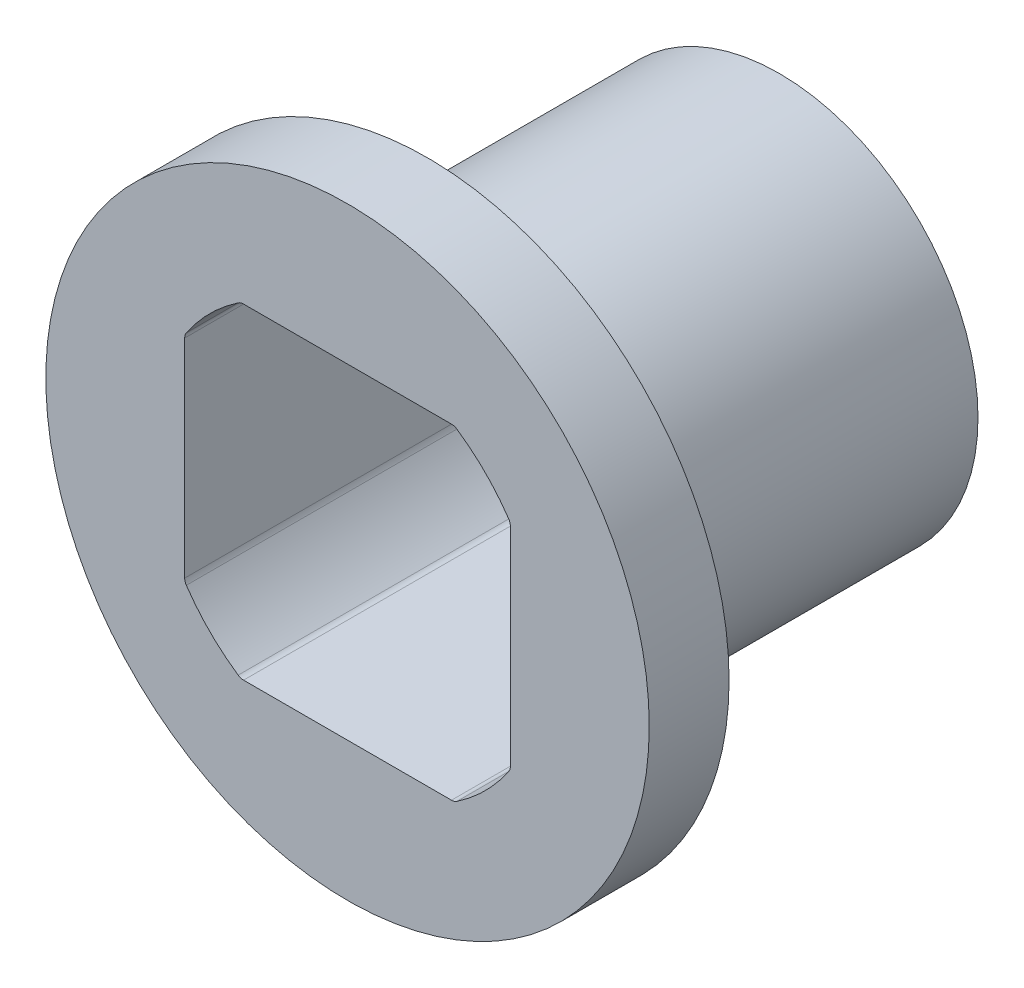
ISO-10303-21;
HEADER;
FILE_DESCRIPTION(('STEP AP214'),'2;1');
FILE_NAME('part.step','',(''),(''),'','','');
FILE_SCHEMA(('AUTOMOTIVE_DESIGN { 1 0 10303 214 1 1 1 1 }'));
ENDSEC;
DATA;
#1=APPLICATION_CONTEXT('core data for automotive mechanical design processes');
#2=APPLICATION_PROTOCOL_DEFINITION('international standard','automotive_design',2000,#1);
#3=PRODUCT_CONTEXT('',#1,'mechanical');
#4=PRODUCT('Part','Part','',(#3));
#5=PRODUCT_RELATED_PRODUCT_CATEGORY('part','',(#4));
#6=PRODUCT_DEFINITION_FORMATION('','',#4);
#7=PRODUCT_DEFINITION_CONTEXT('part definition',#1,'design');
#8=PRODUCT_DEFINITION('design','',#6,#7);
#9=PRODUCT_DEFINITION_SHAPE('','',#8);
#10=(LENGTH_UNIT() NAMED_UNIT(*) SI_UNIT(.MILLI.,.METRE.));
#11=(NAMED_UNIT(*) PLANE_ANGLE_UNIT() SI_UNIT($,.RADIAN.));
#12=(NAMED_UNIT(*) SI_UNIT($,.STERADIAN.) SOLID_ANGLE_UNIT());
#13=UNCERTAINTY_MEASURE_WITH_UNIT(LENGTH_MEASURE(1.E-05),#10,'distance_accuracy_value','');
#14=(GEOMETRIC_REPRESENTATION_CONTEXT(3) GLOBAL_UNCERTAINTY_ASSIGNED_CONTEXT((#13)) GLOBAL_UNIT_ASSIGNED_CONTEXT((#10,
#11,#12)) REPRESENTATION_CONTEXT('',''));
#15=CARTESIAN_POINT('',(0.,0.,0.));
#16=DIRECTION('',(0.,0.,1.));
#17=DIRECTION('',(1.,0.,0.));
#18=AXIS2_PLACEMENT_3D('',#15,#16,#17);
#19=CARTESIAN_POINT('',(0.,0.,8.5875));
#20=DIRECTION('',(0.,0.,-1.));
#21=DIRECTION('',(-1.,0.,0.));
#22=AXIS2_PLACEMENT_3D('',#19,#20,#21);
#23=CYLINDRICAL_SURFACE('',#22,3.9500048);
#24=CARTESIAN_POINT('',(0.,0.,0.));
#25=DIRECTION('',(0.,0.,1.));
#26=DIRECTION('',(1.,0.,0.));
#27=AXIS2_PLACEMENT_3D('',#24,#25,#26);
#28=CIRCLE('',#27,3.9500048);
#29=CARTESIAN_POINT('',(3.9500048,0.,0.));
#30=VERTEX_POINT('',#29);
#31=EDGE_CURVE('E49',#30,#30,#28,.T.);
#32=ORIENTED_EDGE('',*,*,#31,.T.);
#33=EDGE_LOOP('',(#32));
#34=FACE_BOUND('',#33,.T.);
#35=CARTESIAN_POINT('',(0.,0.,7.));
#36=DIRECTION('',(0.,0.,1.));
#37=DIRECTION('',(1.,0.,0.));
#38=AXIS2_PLACEMENT_3D('',#35,#36,#37);
#39=CIRCLE('',#38,3.9500048);
#40=CARTESIAN_POINT('',(3.9500048,0.,7.));
#41=VERTEX_POINT('',#40);
#42=EDGE_CURVE('E11',#41,#41,#39,.T.);
#43=ORIENTED_EDGE('',*,*,#42,.F.);
#44=EDGE_LOOP('',(#43));
#45=FACE_BOUND('',#44,.T.);
#46=ADVANCED_FACE('F41',(#34,#45),#23,.T.);
#47=CARTESIAN_POINT('',(0.,0.,8.5875));
#48=DIRECTION('',(0.,0.,1.));
#49=DIRECTION('',(1.,0.,0.));
#50=AXIS2_PLACEMENT_3D('',#47,#48,#49);
#51=PLANE('',#50);
#52=DIRECTION('',(1.,0.,0.));
#53=VECTOR('',#52,1.);
#54=CARTESIAN_POINT('',(-2.06741021570466,-3.2385,8.5875));
#55=LINE('',#54,#53);
#56=CARTESIAN_POINT('',(-2.06741021570466,-3.2385,8.5875));
#57=VERTEX_POINT('',#56);
#58=CARTESIAN_POINT('',(2.06741021570466,-3.2385,8.5875));
#59=VERTEX_POINT('',#58);
#60=EDGE_CURVE('E163',#57,#59,#55,.T.);
#61=ORIENTED_EDGE('',*,*,#60,.F.);
#62=CARTESIAN_POINT('',(-2.06741021570466,-3.048,8.5875));
#63=DIRECTION('',(0.,0.,1.));
#64=DIRECTION('',(1.,0.,0.));
#65=AXIS2_PLACEMENT_3D('',#62,#63,#64);
#66=CIRCLE('',#65,0.190500000000001);
#67=CARTESIAN_POINT('',(-2.17434522686168,-3.20565517241387,8.5875));
#68=VERTEX_POINT('',#67);
#69=EDGE_CURVE('E154',#68,#57,#66,.T.);
#70=ORIENTED_EDGE('',*,*,#69,.F.);
#71=CARTESIAN_POINT('',(0.,0.,8.5875));
#72=DIRECTION('',(0.,0.,1.));
#73=DIRECTION('',(1.,0.,0.));
#74=AXIS2_PLACEMENT_3D('',#71,#72,#73);
#75=CIRCLE('',#74,3.8735);
#76=CARTESIAN_POINT('',(-3.20565517241379,-2.1743452268618,8.5875));
#77=VERTEX_POINT('',#76);
#78=EDGE_CURVE('E221',#77,#68,#75,.T.);
#79=ORIENTED_EDGE('',*,*,#78,.F.);
#80=CARTESIAN_POINT('',(-3.048,-2.06741021570466,8.5875));
#81=DIRECTION('',(0.,0.,1.));
#82=DIRECTION('',(1.,0.,0.));
#83=AXIS2_PLACEMENT_3D('',#80,#81,#82);
#84=CIRCLE('',#83,0.190500000000001);
#85=CARTESIAN_POINT('',(-3.2385,-2.06741021570466,8.5875));
#86=VERTEX_POINT('',#85);
#87=EDGE_CURVE('E218',#86,#77,#84,.T.);
#88=ORIENTED_EDGE('',*,*,#87,.F.);
#89=DIRECTION('',(0.,-1.,0.));
#90=VECTOR('',#89,1.);
#91=CARTESIAN_POINT('',(-3.2385,2.06741021570466,8.5875));
#92=LINE('',#91,#90);
#93=CARTESIAN_POINT('',(-3.2385,2.06741021570466,8.5875));
#94=VERTEX_POINT('',#93);
#95=EDGE_CURVE('E215',#94,#86,#92,.T.);
#96=ORIENTED_EDGE('',*,*,#95,.F.);
#97=CARTESIAN_POINT('',(-3.048,2.06741021570466,8.5875));
#98=DIRECTION('',(0.,0.,1.));
#99=DIRECTION('',(1.,0.,0.));
#100=AXIS2_PLACEMENT_3D('',#97,#98,#99);
#101=CIRCLE('',#100,0.190500000000003);
#102=CARTESIAN_POINT('',(-3.20565517241388,2.17434522686168,8.5875));
#103=VERTEX_POINT('',#102);
#104=EDGE_CURVE('E212',#103,#94,#101,.T.);
#105=ORIENTED_EDGE('',*,*,#104,.F.);
#106=CARTESIAN_POINT('',(0.,0.,8.5875));
#107=DIRECTION('',(0.,0.,1.));
#108=DIRECTION('',(1.,0.,0.));
#109=AXIS2_PLACEMENT_3D('',#106,#107,#108);
#110=CIRCLE('',#109,3.8735);
#111=CARTESIAN_POINT('',(-2.1743452268618,3.20565517241379,8.5875));
#112=VERTEX_POINT('',#111);
#113=EDGE_CURVE('E209',#112,#103,#110,.T.);
#114=ORIENTED_EDGE('',*,*,#113,.F.);
#115=CARTESIAN_POINT('',(-2.06741021570466,3.048,8.5875));
#116=DIRECTION('',(0.,0.,1.));
#117=DIRECTION('',(1.,0.,0.));
#118=AXIS2_PLACEMENT_3D('',#115,#116,#117);
#119=CIRCLE('',#118,0.190500000000001);
#120=CARTESIAN_POINT('',(-2.06741021570466,3.2385,8.5875));
#121=VERTEX_POINT('',#120);
#122=EDGE_CURVE('E206',#121,#112,#119,.T.);
#123=ORIENTED_EDGE('',*,*,#122,.F.);
#124=DIRECTION('',(-1.,0.,0.));
#125=VECTOR('',#124,1.);
#126=CARTESIAN_POINT('',(2.06741021570466,3.2385,8.5875));
#127=LINE('',#126,#125);
#128=CARTESIAN_POINT('',(2.06741021570466,3.2385,8.5875));
#129=VERTEX_POINT('',#128);
#130=EDGE_CURVE('E203',#129,#121,#127,.T.);
#131=ORIENTED_EDGE('',*,*,#130,.F.);
#132=CARTESIAN_POINT('',(2.06741021570466,3.048,8.5875));
#133=DIRECTION('',(0.,0.,1.));
#134=DIRECTION('',(1.,0.,0.));
#135=AXIS2_PLACEMENT_3D('',#132,#133,#134);
#136=CIRCLE('',#135,0.190500000000001);
#137=CARTESIAN_POINT('',(2.1743452268618,3.20565517241379,8.5875));
#138=VERTEX_POINT('',#137);
#139=EDGE_CURVE('E200',#138,#129,#136,.T.);
#140=ORIENTED_EDGE('',*,*,#139,.F.);
#141=CARTESIAN_POINT('',(0.,0.,8.5875));
#142=DIRECTION('',(0.,0.,1.));
#143=DIRECTION('',(1.,0.,0.));
#144=AXIS2_PLACEMENT_3D('',#141,#142,#143);
#145=CIRCLE('',#144,3.8735);
#146=CARTESIAN_POINT('',(3.20565517241379,2.1743452268618,8.5875));
#147=VERTEX_POINT('',#146);
#148=EDGE_CURVE('E197',#147,#138,#145,.T.);
#149=ORIENTED_EDGE('',*,*,#148,.F.);
#150=CARTESIAN_POINT('',(3.048,2.06741021570466,8.5875));
#151=DIRECTION('',(0.,0.,1.));
#152=DIRECTION('',(1.,0.,0.));
#153=AXIS2_PLACEMENT_3D('',#150,#151,#152);
#154=CIRCLE('',#153,0.190500000000001);
#155=CARTESIAN_POINT('',(3.2385,2.06741021570466,8.5875));
#156=VERTEX_POINT('',#155);
#157=EDGE_CURVE('E194',#156,#147,#154,.T.);
#158=ORIENTED_EDGE('',*,*,#157,.F.);
#159=DIRECTION('',(0.,1.,0.));
#160=VECTOR('',#159,1.);
#161=CARTESIAN_POINT('',(3.2385,-2.06741021570466,8.5875));
#162=LINE('',#161,#160);
#163=CARTESIAN_POINT('',(3.2385,-2.06741021570466,8.5875));
#164=VERTEX_POINT('',#163);
#165=EDGE_CURVE('E191',#164,#156,#162,.T.);
#166=ORIENTED_EDGE('',*,*,#165,.F.);
#167=CARTESIAN_POINT('',(3.048,-2.06741021570466,8.5875));
#168=DIRECTION('',(0.,0.,1.));
#169=DIRECTION('',(1.,0.,0.));
#170=AXIS2_PLACEMENT_3D('',#167,#168,#169);
#171=CIRCLE('',#170,0.190500000000001);
#172=CARTESIAN_POINT('',(3.20565517241379,-2.1743452268618,8.5875));
#173=VERTEX_POINT('',#172);
#174=EDGE_CURVE('E188',#173,#164,#171,.T.);
#175=ORIENTED_EDGE('',*,*,#174,.F.);
#176=CARTESIAN_POINT('',(0.,0.,8.5875));
#177=DIRECTION('',(0.,0.,1.));
#178=DIRECTION('',(1.,0.,0.));
#179=AXIS2_PLACEMENT_3D('',#176,#177,#178);
#180=CIRCLE('',#179,3.8735);
#181=CARTESIAN_POINT('',(2.1743452268618,-3.20565517241379,8.5875));
#182=VERTEX_POINT('',#181);
#183=EDGE_CURVE('E182',#182,#173,#180,.T.);
#184=ORIENTED_EDGE('',*,*,#183,.F.);
#185=CARTESIAN_POINT('',(2.06741021570466,-3.048,8.5875));
#186=DIRECTION('',(0.,0.,1.));
#187=DIRECTION('',(1.,0.,0.));
#188=AXIS2_PLACEMENT_3D('',#185,#186,#187);
#189=CIRCLE('',#188,0.190500000000001);
#190=EDGE_CURVE('E178',#59,#182,#189,.T.);
#191=ORIENTED_EDGE('',*,*,#190,.F.);
#192=EDGE_LOOP('',(#61,#70,#79,#88,#96,#105,#114,#123,#131,#140,#149,#158,#166,#175,#184,#191));
#193=FACE_BOUND('',#192,.T.);
#194=CARTESIAN_POINT('',(0.,0.,8.5875));
#195=DIRECTION('',(0.,0.,1.));
#196=DIRECTION('',(1.,0.,0.));
#197=AXIS2_PLACEMENT_3D('',#194,#195,#196);
#198=CIRCLE('',#197,6.);
#199=CARTESIAN_POINT('',(6.,0.,8.5875));
#200=VERTEX_POINT('',#199);
#201=EDGE_CURVE('E601',#200,#200,#198,.T.);
#202=ORIENTED_EDGE('',*,*,#201,.T.);
#203=EDGE_LOOP('',(#202));
#204=FACE_BOUND('',#203,.T.);
#205=ADVANCED_FACE('F175',(#193,#204),#51,.T.);
#206=CARTESIAN_POINT('',(0.,0.,0.));
#207=DIRECTION('',(0.,0.,1.));
#208=DIRECTION('',(1.,0.,0.));
#209=AXIS2_PLACEMENT_3D('',#206,#207,#208);
#210=PLANE('',#209);
#211=ORIENTED_EDGE('',*,*,#31,.F.);
#212=EDGE_LOOP('',(#211));
#213=FACE_BOUND('',#212,.T.);
#214=CARTESIAN_POINT('',(-2.06741021570466,-3.048,0.));
#215=DIRECTION('',(0.,0.,1.));
#216=DIRECTION('',(1.,0.,0.));
#217=AXIS2_PLACEMENT_3D('',#214,#215,#216);
#218=CIRCLE('',#217,0.190500000000001);
#219=CARTESIAN_POINT('',(-2.17434522686168,-3.20565517241387,0.));
#220=VERTEX_POINT('',#219);
#221=CARTESIAN_POINT('',(-2.06741021570466,-3.2385,0.));
#222=VERTEX_POINT('',#221);
#223=EDGE_CURVE('E64',#220,#222,#218,.T.);
#224=ORIENTED_EDGE('',*,*,#223,.T.);
#225=DIRECTION('',(1.,0.,0.));
#226=VECTOR('',#225,1.);
#227=CARTESIAN_POINT('',(-2.06741021570466,-3.2385,0.));
#228=LINE('',#227,#226);
#229=CARTESIAN_POINT('',(2.06741021570466,-3.2385,0.));
#230=VERTEX_POINT('',#229);
#231=EDGE_CURVE('E170',#222,#230,#228,.T.);
#232=ORIENTED_EDGE('',*,*,#231,.T.);
#233=CARTESIAN_POINT('',(2.06741021570466,-3.048,0.));
#234=DIRECTION('',(0.,0.,1.));
#235=DIRECTION('',(1.,0.,0.));
#236=AXIS2_PLACEMENT_3D('',#233,#234,#235);
#237=CIRCLE('',#236,0.190500000000001);
#238=CARTESIAN_POINT('',(2.1743452268618,-3.20565517241379,0.));
#239=VERTEX_POINT('',#238);
#240=EDGE_CURVE('E229',#230,#239,#237,.T.);
#241=ORIENTED_EDGE('',*,*,#240,.T.);
#242=CARTESIAN_POINT('',(0.,0.,0.));
#243=DIRECTION('',(0.,0.,1.));
#244=DIRECTION('',(1.,0.,0.));
#245=AXIS2_PLACEMENT_3D('',#242,#243,#244);
#246=CIRCLE('',#245,3.8735);
#247=CARTESIAN_POINT('',(3.20565517241379,-2.1743452268618,0.));
#248=VERTEX_POINT('',#247);
#249=EDGE_CURVE('E233',#239,#248,#246,.T.);
#250=ORIENTED_EDGE('',*,*,#249,.T.);
#251=CARTESIAN_POINT('',(3.048,-2.06741021570466,0.));
#252=DIRECTION('',(0.,0.,1.));
#253=DIRECTION('',(1.,0.,0.));
#254=AXIS2_PLACEMENT_3D('',#251,#252,#253);
#255=CIRCLE('',#254,0.190500000000001);
#256=CARTESIAN_POINT('',(3.2385,-2.06741021570466,0.));
#257=VERTEX_POINT('',#256);
#258=EDGE_CURVE('E237',#248,#257,#255,.T.);
#259=ORIENTED_EDGE('',*,*,#258,.T.);
#260=DIRECTION('',(0.,1.,0.));
#261=VECTOR('',#260,1.);
#262=CARTESIAN_POINT('',(3.2385,0.,0.));
#263=LINE('',#262,#261);
#264=CARTESIAN_POINT('',(3.2385,2.06741021570466,0.));
#265=VERTEX_POINT('',#264);
#266=EDGE_CURVE('E241',#257,#265,#263,.T.);
#267=ORIENTED_EDGE('',*,*,#266,.T.);
#268=CARTESIAN_POINT('',(3.048,2.06741021570466,0.));
#269=DIRECTION('',(0.,0.,1.));
#270=DIRECTION('',(1.,0.,0.));
#271=AXIS2_PLACEMENT_3D('',#268,#269,#270);
#272=CIRCLE('',#271,0.190500000000001);
#273=CARTESIAN_POINT('',(3.20565517241379,2.1743452268618,0.));
#274=VERTEX_POINT('',#273);
#275=EDGE_CURVE('E245',#265,#274,#272,.T.);
#276=ORIENTED_EDGE('',*,*,#275,.T.);
#277=CARTESIAN_POINT('',(0.,0.,0.));
#278=DIRECTION('',(0.,0.,1.));
#279=DIRECTION('',(1.,0.,0.));
#280=AXIS2_PLACEMENT_3D('',#277,#278,#279);
#281=CIRCLE('',#280,3.8735);
#282=CARTESIAN_POINT('',(2.1743452268618,3.20565517241379,0.));
#283=VERTEX_POINT('',#282);
#284=EDGE_CURVE('E249',#274,#283,#281,.T.);
#285=ORIENTED_EDGE('',*,*,#284,.T.);
#286=CARTESIAN_POINT('',(2.06741021570466,3.048,0.));
#287=DIRECTION('',(0.,0.,1.));
#288=DIRECTION('',(1.,0.,0.));
#289=AXIS2_PLACEMENT_3D('',#286,#287,#288);
#290=CIRCLE('',#289,0.190500000000001);
#291=CARTESIAN_POINT('',(2.06741021570466,3.2385,0.));
#292=VERTEX_POINT('',#291);
#293=EDGE_CURVE('E253',#283,#292,#290,.T.);
#294=ORIENTED_EDGE('',*,*,#293,.T.);
#295=DIRECTION('',(-1.,0.,0.));
#296=VECTOR('',#295,1.);
#297=CARTESIAN_POINT('',(2.06741021570466,3.2385,0.));
#298=LINE('',#297,#296);
#299=CARTESIAN_POINT('',(-2.06741021570466,3.2385,0.));
#300=VERTEX_POINT('',#299);
#301=EDGE_CURVE('E257',#292,#300,#298,.T.);
#302=ORIENTED_EDGE('',*,*,#301,.T.);
#303=CARTESIAN_POINT('',(-2.06741021570466,3.048,0.));
#304=DIRECTION('',(0.,0.,1.));
#305=DIRECTION('',(1.,0.,0.));
#306=AXIS2_PLACEMENT_3D('',#303,#304,#305);
#307=CIRCLE('',#306,0.190500000000001);
#308=CARTESIAN_POINT('',(-2.1743452268618,3.20565517241379,0.));
#309=VERTEX_POINT('',#308);
#310=EDGE_CURVE('E261',#300,#309,#307,.T.);
#311=ORIENTED_EDGE('',*,*,#310,.T.);
#312=CARTESIAN_POINT('',(0.,0.,0.));
#313=DIRECTION('',(0.,0.,1.));
#314=DIRECTION('',(1.,0.,0.));
#315=AXIS2_PLACEMENT_3D('',#312,#313,#314);
#316=CIRCLE('',#315,3.8735);
#317=CARTESIAN_POINT('',(-3.20565517241388,2.17434522686168,0.));
#318=VERTEX_POINT('',#317);
#319=EDGE_CURVE('E265',#309,#318,#316,.T.);
#320=ORIENTED_EDGE('',*,*,#319,.T.);
#321=CARTESIAN_POINT('',(-3.048,2.06741021570466,0.));
#322=DIRECTION('',(0.,0.,1.));
#323=DIRECTION('',(1.,0.,0.));
#324=AXIS2_PLACEMENT_3D('',#321,#322,#323);
#325=CIRCLE('',#324,0.190500000000003);
#326=CARTESIAN_POINT('',(-3.2385,2.06741021570466,0.));
#327=VERTEX_POINT('',#326);
#328=EDGE_CURVE('E269',#318,#327,#325,.T.);
#329=ORIENTED_EDGE('',*,*,#328,.T.);
#330=DIRECTION('',(0.,-1.,0.));
#331=VECTOR('',#330,1.);
#332=CARTESIAN_POINT('',(-3.2385,0.,0.));
#333=LINE('',#332,#331);
#334=CARTESIAN_POINT('',(-3.2385,-2.06741021570466,0.));
#335=VERTEX_POINT('',#334);
#336=EDGE_CURVE('E273',#327,#335,#333,.T.);
#337=ORIENTED_EDGE('',*,*,#336,.T.);
#338=CARTESIAN_POINT('',(-3.048,-2.06741021570466,0.));
#339=DIRECTION('',(0.,0.,1.));
#340=DIRECTION('',(1.,0.,0.));
#341=AXIS2_PLACEMENT_3D('',#338,#339,#340);
#342=CIRCLE('',#341,0.190500000000001);
#343=CARTESIAN_POINT('',(-3.20565517241379,-2.1743452268618,0.));
#344=VERTEX_POINT('',#343);
#345=EDGE_CURVE('E277',#335,#344,#342,.T.);
#346=ORIENTED_EDGE('',*,*,#345,.T.);
#347=CARTESIAN_POINT('',(0.,0.,0.));
#348=DIRECTION('',(0.,0.,1.));
#349=DIRECTION('',(1.,0.,0.));
#350=AXIS2_PLACEMENT_3D('',#347,#348,#349);
#351=CIRCLE('',#350,3.8735);
#352=EDGE_CURVE('E164',#344,#220,#351,.T.);
#353=ORIENTED_EDGE('',*,*,#352,.T.);
#354=EDGE_LOOP('',(#224,#232,#241,#250,#259,#267,#276,#285,#294,#302,#311,#320,#329,#337,#346,#353));
#355=FACE_BOUND('',#354,.T.);
#356=ADVANCED_FACE('F333',(#213,#355),#210,.F.);
#357=CARTESIAN_POINT('',(-2.06741021570466,-3.048,8.5875));
#358=DIRECTION('',(0.,0.,-1.));
#359=DIRECTION('',(-1.,0.,0.));
#360=AXIS2_PLACEMENT_3D('',#357,#358,#359);
#361=CYLINDRICAL_SURFACE('',#360,0.190500000000001);
#362=ORIENTED_EDGE('',*,*,#223,.F.);
#363=DIRECTION('',(0.,0.,-1.));
#364=VECTOR('',#363,1.);
#365=CARTESIAN_POINT('',(-2.17434522686168,-3.20565517241387,8.5875));
#366=LINE('',#365,#364);
#367=EDGE_CURVE('E158',#68,#220,#366,.T.);
#368=ORIENTED_EDGE('',*,*,#367,.F.);
#369=ORIENTED_EDGE('',*,*,#69,.T.);
#370=DIRECTION('',(0.,0.,-1.));
#371=VECTOR('',#370,1.);
#372=CARTESIAN_POINT('',(-2.06741021570466,-3.2385,8.5875));
#373=LINE('',#372,#371);
#374=EDGE_CURVE('E157',#57,#222,#373,.T.);
#375=ORIENTED_EDGE('',*,*,#374,.T.);
#376=EDGE_LOOP('',(#362,#368,#369,#375));
#377=FACE_BOUND('',#376,.T.);
#378=ADVANCED_FACE('F156',(#377),#361,.F.);
#379=CARTESIAN_POINT('',(-2.06741021570466,-3.2385,8.5875));
#380=DIRECTION('',(0.,1.,0.));
#381=DIRECTION('',(0.,0.,1.));
#382=AXIS2_PLACEMENT_3D('',#379,#380,#381);
#383=PLANE('',#382);
#384=ORIENTED_EDGE('',*,*,#231,.F.);
#385=ORIENTED_EDGE('',*,*,#374,.F.);
#386=ORIENTED_EDGE('',*,*,#60,.T.);
#387=DIRECTION('',(0.,0.,-1.));
#388=VECTOR('',#387,1.);
#389=CARTESIAN_POINT('',(2.06741021570466,-3.2385,8.5875));
#390=LINE('',#389,#388);
#391=EDGE_CURVE('E172',#59,#230,#390,.T.);
#392=ORIENTED_EDGE('',*,*,#391,.T.);
#393=EDGE_LOOP('',(#384,#385,#386,#392));
#394=FACE_BOUND('',#393,.T.);
#395=ADVANCED_FACE('F167',(#394),#383,.T.);
#396=CARTESIAN_POINT('',(2.06741021570466,-3.048,8.5875));
#397=DIRECTION('',(0.,0.,-1.));
#398=DIRECTION('',(-1.,0.,0.));
#399=AXIS2_PLACEMENT_3D('',#396,#397,#398);
#400=CYLINDRICAL_SURFACE('',#399,0.190500000000001);
#401=ORIENTED_EDGE('',*,*,#240,.F.);
#402=ORIENTED_EDGE('',*,*,#391,.F.);
#403=ORIENTED_EDGE('',*,*,#190,.T.);
#404=DIRECTION('',(0.,0.,-1.));
#405=VECTOR('',#404,1.);
#406=CARTESIAN_POINT('',(2.1743452268618,-3.20565517241379,8.5875));
#407=LINE('',#406,#405);
#408=EDGE_CURVE('E323',#182,#239,#407,.T.);
#409=ORIENTED_EDGE('',*,*,#408,.T.);
#410=EDGE_LOOP('',(#401,#402,#403,#409));
#411=FACE_BOUND('',#410,.T.);
#412=ADVANCED_FACE('F396',(#411),#400,.F.);
#413=CARTESIAN_POINT('',(0.,0.,8.5875));
#414=DIRECTION('',(0.,0.,-1.));
#415=DIRECTION('',(-1.,0.,0.));
#416=AXIS2_PLACEMENT_3D('',#413,#414,#415);
#417=CYLINDRICAL_SURFACE('',#416,3.8735);
#418=ORIENTED_EDGE('',*,*,#249,.F.);
#419=ORIENTED_EDGE('',*,*,#408,.F.);
#420=ORIENTED_EDGE('',*,*,#183,.T.);
#421=DIRECTION('',(0.,0.,-1.));
#422=VECTOR('',#421,1.);
#423=CARTESIAN_POINT('',(3.20565517241379,-2.1743452268618,8.5875));
#424=LINE('',#423,#422);
#425=EDGE_CURVE('E320',#173,#248,#424,.T.);
#426=ORIENTED_EDGE('',*,*,#425,.T.);
#427=EDGE_LOOP('',(#418,#419,#420,#426));
#428=FACE_BOUND('',#427,.T.);
#429=ADVANCED_FACE('F392',(#428),#417,.F.);
#430=CARTESIAN_POINT('',(3.048,-2.06741021570466,8.5875));
#431=DIRECTION('',(0.,0.,-1.));
#432=DIRECTION('',(-1.,0.,0.));
#433=AXIS2_PLACEMENT_3D('',#430,#431,#432);
#434=CYLINDRICAL_SURFACE('',#433,0.190500000000001);
#435=ORIENTED_EDGE('',*,*,#258,.F.);
#436=ORIENTED_EDGE('',*,*,#425,.F.);
#437=ORIENTED_EDGE('',*,*,#174,.T.);
#438=DIRECTION('',(0.,0.,-1.));
#439=VECTOR('',#438,1.);
#440=CARTESIAN_POINT('',(3.2385,-2.06741021570466,8.5875));
#441=LINE('',#440,#439);
#442=EDGE_CURVE('E316',#164,#257,#441,.T.);
#443=ORIENTED_EDGE('',*,*,#442,.T.);
#444=EDGE_LOOP('',(#435,#436,#437,#443));
#445=FACE_BOUND('',#444,.T.);
#446=ADVANCED_FACE('F389',(#445),#434,.F.);
#447=CARTESIAN_POINT('',(3.2385,0.,8.5875));
#448=DIRECTION('',(-1.,0.,0.));
#449=DIRECTION('',(0.,0.,1.));
#450=AXIS2_PLACEMENT_3D('',#447,#448,#449);
#451=PLANE('',#450);
#452=ORIENTED_EDGE('',*,*,#266,.F.);
#453=ORIENTED_EDGE('',*,*,#442,.F.);
#454=ORIENTED_EDGE('',*,*,#165,.T.);
#455=DIRECTION('',(0.,0.,-1.));
#456=VECTOR('',#455,1.);
#457=CARTESIAN_POINT('',(3.2385,2.06741021570466,8.5875));
#458=LINE('',#457,#456);
#459=EDGE_CURVE('E313',#156,#265,#458,.T.);
#460=ORIENTED_EDGE('',*,*,#459,.T.);
#461=EDGE_LOOP('',(#452,#453,#454,#460));
#462=FACE_BOUND('',#461,.T.);
#463=ADVANCED_FACE('F383',(#462),#451,.T.);
#464=CARTESIAN_POINT('',(3.048,2.06741021570466,8.5875));
#465=DIRECTION('',(0.,0.,-1.));
#466=DIRECTION('',(-1.,0.,0.));
#467=AXIS2_PLACEMENT_3D('',#464,#465,#466);
#468=CYLINDRICAL_SURFACE('',#467,0.190500000000001);
#469=ORIENTED_EDGE('',*,*,#275,.F.);
#470=ORIENTED_EDGE('',*,*,#459,.F.);
#471=ORIENTED_EDGE('',*,*,#157,.T.);
#472=DIRECTION('',(0.,0.,-1.));
#473=VECTOR('',#472,1.);
#474=CARTESIAN_POINT('',(3.20565517241379,2.1743452268618,8.5875));
#475=LINE('',#474,#473);
#476=EDGE_CURVE('E310',#147,#274,#475,.T.);
#477=ORIENTED_EDGE('',*,*,#476,.T.);
#478=EDGE_LOOP('',(#469,#470,#471,#477));
#479=FACE_BOUND('',#478,.T.);
#480=ADVANCED_FACE('F380',(#479),#468,.F.);
#481=CARTESIAN_POINT('',(0.,0.,8.5875));
#482=DIRECTION('',(0.,0.,-1.));
#483=DIRECTION('',(-1.,0.,0.));
#484=AXIS2_PLACEMENT_3D('',#481,#482,#483);
#485=CYLINDRICAL_SURFACE('',#484,3.8735);
#486=ORIENTED_EDGE('',*,*,#284,.F.);
#487=ORIENTED_EDGE('',*,*,#476,.F.);
#488=ORIENTED_EDGE('',*,*,#148,.T.);
#489=DIRECTION('',(0.,0.,-1.));
#490=VECTOR('',#489,1.);
#491=CARTESIAN_POINT('',(2.1743452268618,3.20565517241379,8.5875));
#492=LINE('',#491,#490);
#493=EDGE_CURVE('E307',#138,#283,#492,.T.);
#494=ORIENTED_EDGE('',*,*,#493,.T.);
#495=EDGE_LOOP('',(#486,#487,#488,#494));
#496=FACE_BOUND('',#495,.T.);
#497=ADVANCED_FACE('F377',(#496),#485,.F.);
#498=CARTESIAN_POINT('',(2.06741021570466,3.048,8.5875));
#499=DIRECTION('',(0.,0.,-1.));
#500=DIRECTION('',(-1.,0.,0.));
#501=AXIS2_PLACEMENT_3D('',#498,#499,#500);
#502=CYLINDRICAL_SURFACE('',#501,0.190500000000001);
#503=ORIENTED_EDGE('',*,*,#293,.F.);
#504=ORIENTED_EDGE('',*,*,#493,.F.);
#505=ORIENTED_EDGE('',*,*,#139,.T.);
#506=DIRECTION('',(0.,0.,-1.));
#507=VECTOR('',#506,1.);
#508=CARTESIAN_POINT('',(2.06741021570466,3.2385,8.5875));
#509=LINE('',#508,#507);
#510=EDGE_CURVE('E304',#129,#292,#509,.T.);
#511=ORIENTED_EDGE('',*,*,#510,.T.);
#512=EDGE_LOOP('',(#503,#504,#505,#511));
#513=FACE_BOUND('',#512,.T.);
#514=ADVANCED_FACE('F369',(#513),#502,.F.);
#515=CARTESIAN_POINT('',(2.06741021570466,3.2385,8.5875));
#516=DIRECTION('',(0.,-1.,0.));
#517=DIRECTION('',(1.,0.,0.));
#518=AXIS2_PLACEMENT_3D('',#515,#516,#517);
#519=PLANE('',#518);
#520=ORIENTED_EDGE('',*,*,#301,.F.);
#521=ORIENTED_EDGE('',*,*,#510,.F.);
#522=ORIENTED_EDGE('',*,*,#130,.T.);
#523=DIRECTION('',(0.,0.,-1.));
#524=VECTOR('',#523,1.);
#525=CARTESIAN_POINT('',(-2.06741021570466,3.2385,8.5875));
#526=LINE('',#525,#524);
#527=EDGE_CURVE('E301',#121,#300,#526,.T.);
#528=ORIENTED_EDGE('',*,*,#527,.T.);
#529=EDGE_LOOP('',(#520,#521,#522,#528));
#530=FACE_BOUND('',#529,.T.);
#531=ADVANCED_FACE('F365',(#530),#519,.T.);
#532=CARTESIAN_POINT('',(-2.06741021570466,3.048,8.5875));
#533=DIRECTION('',(0.,0.,-1.));
#534=DIRECTION('',(-1.,0.,0.));
#535=AXIS2_PLACEMENT_3D('',#532,#533,#534);
#536=CYLINDRICAL_SURFACE('',#535,0.190500000000001);
#537=ORIENTED_EDGE('',*,*,#310,.F.);
#538=ORIENTED_EDGE('',*,*,#527,.F.);
#539=ORIENTED_EDGE('',*,*,#122,.T.);
#540=DIRECTION('',(0.,0.,-1.));
#541=VECTOR('',#540,1.);
#542=CARTESIAN_POINT('',(-2.1743452268618,3.20565517241379,8.5875));
#543=LINE('',#542,#541);
#544=EDGE_CURVE('E298',#112,#309,#543,.T.);
#545=ORIENTED_EDGE('',*,*,#544,.T.);
#546=EDGE_LOOP('',(#537,#538,#539,#545));
#547=FACE_BOUND('',#546,.T.);
#548=ADVANCED_FACE('F362',(#547),#536,.F.);
#549=CARTESIAN_POINT('',(0.,0.,8.5875));
#550=DIRECTION('',(0.,0.,-1.));
#551=DIRECTION('',(-1.,0.,0.));
#552=AXIS2_PLACEMENT_3D('',#549,#550,#551);
#553=CYLINDRICAL_SURFACE('',#552,3.8735);
#554=ORIENTED_EDGE('',*,*,#319,.F.);
#555=ORIENTED_EDGE('',*,*,#544,.F.);
#556=ORIENTED_EDGE('',*,*,#113,.T.);
#557=DIRECTION('',(0.,0.,-1.));
#558=VECTOR('',#557,1.);
#559=CARTESIAN_POINT('',(-3.20565517241388,2.17434522686168,8.5875));
#560=LINE('',#559,#558);
#561=EDGE_CURVE('E295',#103,#318,#560,.T.);
#562=ORIENTED_EDGE('',*,*,#561,.T.);
#563=EDGE_LOOP('',(#554,#555,#556,#562));
#564=FACE_BOUND('',#563,.T.);
#565=ADVANCED_FACE('F355',(#564),#553,.F.);
#566=CARTESIAN_POINT('',(-3.048,2.06741021570466,8.5875));
#567=DIRECTION('',(0.,0.,-1.));
#568=DIRECTION('',(-1.,0.,0.));
#569=AXIS2_PLACEMENT_3D('',#566,#567,#568);
#570=CYLINDRICAL_SURFACE('',#569,0.190500000000003);
#571=ORIENTED_EDGE('',*,*,#328,.F.);
#572=ORIENTED_EDGE('',*,*,#561,.F.);
#573=ORIENTED_EDGE('',*,*,#104,.T.);
#574=DIRECTION('',(0.,0.,-1.));
#575=VECTOR('',#574,1.);
#576=CARTESIAN_POINT('',(-3.2385,2.06741021570466,8.5875));
#577=LINE('',#576,#575);
#578=EDGE_CURVE('E291',#94,#327,#577,.T.);
#579=ORIENTED_EDGE('',*,*,#578,.T.);
#580=EDGE_LOOP('',(#571,#572,#573,#579));
#581=FACE_BOUND('',#580,.T.);
#582=ADVANCED_FACE('F349',(#581),#570,.F.);
#583=CARTESIAN_POINT('',(-3.2385,0.,8.5875));
#584=DIRECTION('',(1.,0.,0.));
#585=DIRECTION('',(0.,0.,-1.));
#586=AXIS2_PLACEMENT_3D('',#583,#584,#585);
#587=PLANE('',#586);
#588=ORIENTED_EDGE('',*,*,#336,.F.);
#589=ORIENTED_EDGE('',*,*,#578,.F.);
#590=ORIENTED_EDGE('',*,*,#95,.T.);
#591=DIRECTION('',(0.,0.,-1.));
#592=VECTOR('',#591,1.);
#593=CARTESIAN_POINT('',(-3.2385,-2.06741021570466,8.5875));
#594=LINE('',#593,#592);
#595=EDGE_CURVE('E288',#86,#335,#594,.T.);
#596=ORIENTED_EDGE('',*,*,#595,.T.);
#597=EDGE_LOOP('',(#588,#589,#590,#596));
#598=FACE_BOUND('',#597,.T.);
#599=ADVANCED_FACE('F345',(#598),#587,.T.);
#600=CARTESIAN_POINT('',(-3.048,-2.06741021570466,8.5875));
#601=DIRECTION('',(0.,0.,-1.));
#602=DIRECTION('',(-1.,0.,0.));
#603=AXIS2_PLACEMENT_3D('',#600,#601,#602);
#604=CYLINDRICAL_SURFACE('',#603,0.190500000000001);
#605=ORIENTED_EDGE('',*,*,#345,.F.);
#606=ORIENTED_EDGE('',*,*,#595,.F.);
#607=ORIENTED_EDGE('',*,*,#87,.T.);
#608=DIRECTION('',(0.,0.,-1.));
#609=VECTOR('',#608,1.);
#610=CARTESIAN_POINT('',(-3.20565517241379,-2.1743452268618,8.5875));
#611=LINE('',#610,#609);
#612=EDGE_CURVE('E56',#77,#344,#611,.T.);
#613=ORIENTED_EDGE('',*,*,#612,.T.);
#614=EDGE_LOOP('',(#605,#606,#607,#613));
#615=FACE_BOUND('',#614,.T.);
#616=ADVANCED_FACE('F343',(#615),#604,.F.);
#617=CARTESIAN_POINT('',(0.,0.,8.5875));
#618=DIRECTION('',(0.,0.,-1.));
#619=DIRECTION('',(-1.,0.,0.));
#620=AXIS2_PLACEMENT_3D('',#617,#618,#619);
#621=CYLINDRICAL_SURFACE('',#620,3.8735);
#622=ORIENTED_EDGE('',*,*,#352,.F.);
#623=ORIENTED_EDGE('',*,*,#612,.F.);
#624=ORIENTED_EDGE('',*,*,#78,.T.);
#625=ORIENTED_EDGE('',*,*,#367,.T.);
#626=EDGE_LOOP('',(#622,#623,#624,#625));
#627=FACE_BOUND('',#626,.T.);
#628=ADVANCED_FACE('F337',(#627),#621,.F.);
#629=CARTESIAN_POINT('',(0.,0.,7.));
#630=DIRECTION('',(0.,0.,1.));
#631=DIRECTION('',(1.,0.,0.));
#632=AXIS2_PLACEMENT_3D('',#629,#630,#631);
#633=CYLINDRICAL_SURFACE('',#632,6.);
#634=CARTESIAN_POINT('',(0.,0.,7.));
#635=DIRECTION('',(0.,0.,1.));
#636=DIRECTION('',(1.,0.,0.));
#637=AXIS2_PLACEMENT_3D('',#634,#635,#636);
#638=CIRCLE('',#637,6.);
#639=CARTESIAN_POINT('',(6.,0.,7.));
#640=VERTEX_POINT('',#639);
#641=EDGE_CURVE('E226',#640,#640,#638,.T.);
#642=ORIENTED_EDGE('',*,*,#641,.T.);
#643=EDGE_LOOP('',(#642));
#644=FACE_BOUND('',#643,.T.);
#645=ORIENTED_EDGE('',*,*,#201,.F.);
#646=EDGE_LOOP('',(#645));
#647=FACE_BOUND('',#646,.T.);
#648=ADVANCED_FACE('F513',(#644,#647),#633,.T.);
#649=CARTESIAN_POINT('',(0.,0.,7.));
#650=DIRECTION('',(0.,0.,1.));
#651=DIRECTION('',(1.,0.,0.));
#652=AXIS2_PLACEMENT_3D('',#649,#650,#651);
#653=PLANE('',#652);
#654=ORIENTED_EDGE('',*,*,#42,.T.);
#655=EDGE_LOOP('',(#654));
#656=FACE_BOUND('',#655,.T.);
#657=ORIENTED_EDGE('',*,*,#641,.F.);
#658=EDGE_LOOP('',(#657));
#659=FACE_BOUND('',#658,.T.);
#660=ADVANCED_FACE('F522',(#656,#659),#653,.F.);
#661=CLOSED_SHELL('',(#46,#205,#356,#378,#395,#412,#429,#446,#463,#480,#497,#514,#531,#548,#565,
#582,#599,#616,#628,#648,#660));
#662=MANIFOLD_SOLID_BREP('B2',#661);
#663=ADVANCED_BREP_SHAPE_REPRESENTATION('',(#18,#662),#14);
#664=SHAPE_DEFINITION_REPRESENTATION(#9,#663);
ENDSEC;
END-ISO-10303-21;
